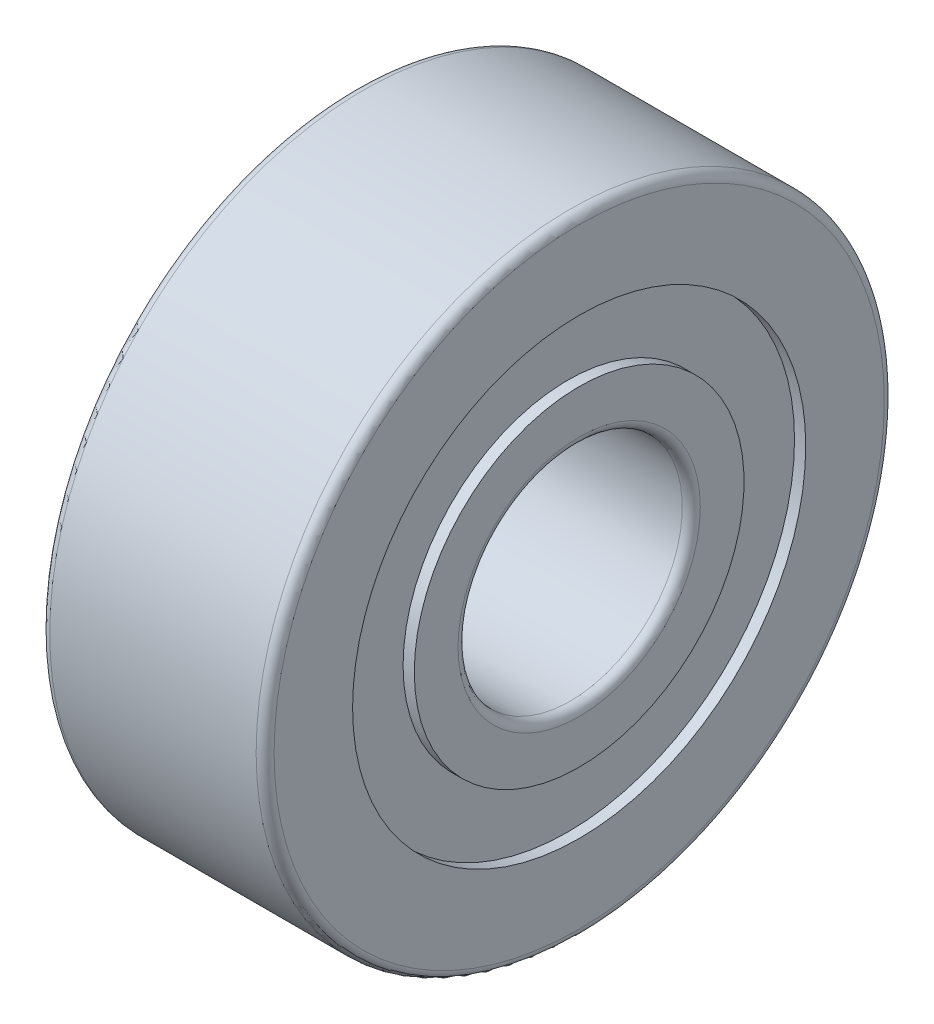
ISO-10303-21;
HEADER;
FILE_DESCRIPTION(('STEP AP214'),'2;1');
FILE_NAME('part.step','',(''),(''),'','','');
FILE_SCHEMA(('AUTOMOTIVE_DESIGN { 1 0 10303 214 1 1 1 1 }'));
ENDSEC;
DATA;
#1=APPLICATION_CONTEXT('core data for automotive mechanical design processes');
#2=APPLICATION_PROTOCOL_DEFINITION('international standard','automotive_design',2000,#1);
#3=PRODUCT_CONTEXT('',#1,'mechanical');
#4=PRODUCT('Part','Part','',(#3));
#5=PRODUCT_RELATED_PRODUCT_CATEGORY('part','',(#4));
#6=PRODUCT_DEFINITION_FORMATION('','',#4);
#7=PRODUCT_DEFINITION_CONTEXT('part definition',#1,'design');
#8=PRODUCT_DEFINITION('design','',#6,#7);
#9=PRODUCT_DEFINITION_SHAPE('','',#8);
#10=(LENGTH_UNIT() NAMED_UNIT(*) SI_UNIT(.MILLI.,.METRE.));
#11=(NAMED_UNIT(*) PLANE_ANGLE_UNIT() SI_UNIT($,.RADIAN.));
#12=(NAMED_UNIT(*) SI_UNIT($,.STERADIAN.) SOLID_ANGLE_UNIT());
#13=UNCERTAINTY_MEASURE_WITH_UNIT(LENGTH_MEASURE(1.E-05),#10,'distance_accuracy_value','');
#14=(GEOMETRIC_REPRESENTATION_CONTEXT(3) GLOBAL_UNCERTAINTY_ASSIGNED_CONTEXT((#13)) GLOBAL_UNIT_ASSIGNED_CONTEXT((#10,
#11,#12)) REPRESENTATION_CONTEXT('',''));
#15=CARTESIAN_POINT('',(0.,0.,0.));
#16=DIRECTION('',(0.,0.,1.));
#17=DIRECTION('',(1.,0.,0.));
#18=AXIS2_PLACEMENT_3D('',#15,#16,#17);
#19=CARTESIAN_POINT('',(-2.5,7.,0.));
#20=DIRECTION('',(1.,0.,0.));
#21=DIRECTION('',(0.,0.,-1.));
#22=AXIS2_PLACEMENT_3D('',#19,#20,#21);
#23=PLANE('',#22);
#24=CARTESIAN_POINT('',(-2.5,0.,0.));
#25=DIRECTION('',(1.,0.,0.));
#26=DIRECTION('',(0.,0.,-1.));
#27=AXIS2_PLACEMENT_3D('',#24,#25,#26);
#28=CIRCLE('',#27,6.8);
#29=CARTESIAN_POINT('',(-2.5,0.,-6.8));
#30=VERTEX_POINT('',#29);
#31=EDGE_CURVE('E45',#30,#30,#28,.F.);
#32=ORIENTED_EDGE('',*,*,#31,.T.);
#33=EDGE_LOOP('',(#32));
#34=FACE_BOUND('',#33,.T.);
#35=CARTESIAN_POINT('',(-2.5,0.,0.));
#36=DIRECTION('',(-1.,0.,0.));
#37=DIRECTION('',(0.,0.,1.));
#38=AXIS2_PLACEMENT_3D('',#35,#36,#37);
#39=CIRCLE('',#38,5.05);
#40=CARTESIAN_POINT('',(-2.5,0.,5.05));
#41=VERTEX_POINT('',#40);
#42=EDGE_CURVE('E62',#41,#41,#39,.T.);
#43=ORIENTED_EDGE('',*,*,#42,.F.);
#44=EDGE_LOOP('',(#43));
#45=FACE_BOUND('',#44,.T.);
#46=ADVANCED_FACE('F30',(#34,#45),#23,.F.);
#47=CARTESIAN_POINT('',(0.,0.,0.));
#48=DIRECTION('',(-1.,0.,0.));
#49=DIRECTION('',(0.,0.,1.));
#50=AXIS2_PLACEMENT_3D('',#47,#48,#49);
#51=CYLINDRICAL_SURFACE('',#50,5.05);
#52=CARTESIAN_POINT('',(-2.25,0.,0.));
#53=DIRECTION('',(-1.,0.,0.));
#54=DIRECTION('',(0.,0.,1.));
#55=AXIS2_PLACEMENT_3D('',#52,#53,#54);
#56=CIRCLE('',#55,5.05);
#57=CARTESIAN_POINT('',(-2.25,0.,5.05));
#58=VERTEX_POINT('',#57);
#59=EDGE_CURVE('E65',#58,#58,#56,.T.);
#60=ORIENTED_EDGE('',*,*,#59,.F.);
#61=EDGE_LOOP('',(#60));
#62=FACE_BOUND('',#61,.T.);
#63=ORIENTED_EDGE('',*,*,#42,.T.);
#64=EDGE_LOOP('',(#63));
#65=FACE_BOUND('',#64,.T.);
#66=ADVANCED_FACE('F119',(#62,#65),#51,.F.);
#67=CARTESIAN_POINT('',(-2.25,5.05,0.));
#68=DIRECTION('',(1.,0.,0.));
#69=DIRECTION('',(0.,0.,-1.));
#70=AXIS2_PLACEMENT_3D('',#67,#68,#69);
#71=PLANE('',#70);
#72=CARTESIAN_POINT('',(-2.25,0.,0.));
#73=DIRECTION('',(-1.,0.,0.));
#74=DIRECTION('',(0.,0.,1.));
#75=AXIS2_PLACEMENT_3D('',#72,#73,#74);
#76=CIRCLE('',#75,3.675);
#77=CARTESIAN_POINT('',(-2.25,0.,3.675));
#78=VERTEX_POINT('',#77);
#79=EDGE_CURVE('E68',#78,#78,#76,.T.);
#80=ORIENTED_EDGE('',*,*,#79,.F.);
#81=EDGE_LOOP('',(#80));
#82=FACE_BOUND('',#81,.T.);
#83=ORIENTED_EDGE('',*,*,#59,.T.);
#84=EDGE_LOOP('',(#83));
#85=FACE_BOUND('',#84,.T.);
#86=ADVANCED_FACE('F125',(#82,#85),#71,.F.);
#87=CARTESIAN_POINT('',(0.,0.,0.));
#88=DIRECTION('',(-1.,0.,0.));
#89=DIRECTION('',(0.,0.,1.));
#90=AXIS2_PLACEMENT_3D('',#87,#88,#89);
#91=CYLINDRICAL_SURFACE('',#90,3.675);
#92=CARTESIAN_POINT('',(-2.5,0.,0.));
#93=DIRECTION('',(-1.,0.,0.));
#94=DIRECTION('',(0.,0.,1.));
#95=AXIS2_PLACEMENT_3D('',#92,#93,#94);
#96=CIRCLE('',#95,3.675);
#97=CARTESIAN_POINT('',(-2.5,0.,3.675));
#98=VERTEX_POINT('',#97);
#99=EDGE_CURVE('E71',#98,#98,#96,.T.);
#100=ORIENTED_EDGE('',*,*,#99,.F.);
#101=EDGE_LOOP('',(#100));
#102=FACE_BOUND('',#101,.T.);
#103=ORIENTED_EDGE('',*,*,#79,.T.);
#104=EDGE_LOOP('',(#103));
#105=FACE_BOUND('',#104,.T.);
#106=ADVANCED_FACE('F179',(#102,#105),#91,.T.);
#107=CARTESIAN_POINT('',(-2.5,3.675,0.));
#108=DIRECTION('',(1.,0.,0.));
#109=DIRECTION('',(0.,0.,-1.));
#110=AXIS2_PLACEMENT_3D('',#107,#108,#109);
#111=PLANE('',#110);
#112=CARTESIAN_POINT('',(-2.5,0.,0.));
#113=DIRECTION('',(1.,0.,0.));
#114=DIRECTION('',(0.,0.,-1.));
#115=AXIS2_PLACEMENT_3D('',#112,#113,#114);
#116=CIRCLE('',#115,2.7);
#117=CARTESIAN_POINT('',(-2.5,0.,-2.7));
#118=VERTEX_POINT('',#117);
#119=EDGE_CURVE('E53',#118,#118,#116,.T.);
#120=ORIENTED_EDGE('',*,*,#119,.T.);
#121=EDGE_LOOP('',(#120));
#122=FACE_BOUND('',#121,.T.);
#123=ORIENTED_EDGE('',*,*,#99,.T.);
#124=EDGE_LOOP('',(#123));
#125=FACE_BOUND('',#124,.T.);
#126=ADVANCED_FACE('F115',(#122,#125),#111,.F.);
#127=CARTESIAN_POINT('',(0.,0.,0.));
#128=DIRECTION('',(-1.,0.,0.));
#129=DIRECTION('',(0.,0.,1.));
#130=AXIS2_PLACEMENT_3D('',#127,#128,#129);
#131=CYLINDRICAL_SURFACE('',#130,2.5);
#132=CARTESIAN_POINT('',(-2.3,0.,0.));
#133=DIRECTION('',(1.,0.,0.));
#134=DIRECTION('',(0.,0.,-1.));
#135=AXIS2_PLACEMENT_3D('',#132,#133,#134);
#136=CIRCLE('',#135,2.5);
#137=CARTESIAN_POINT('',(-2.3,0.,-2.5));
#138=VERTEX_POINT('',#137);
#139=EDGE_CURVE('E56',#138,#138,#136,.F.);
#140=ORIENTED_EDGE('',*,*,#139,.T.);
#141=EDGE_LOOP('',(#140));
#142=FACE_BOUND('',#141,.T.);
#143=CARTESIAN_POINT('',(2.3,0.,0.));
#144=DIRECTION('',(-1.,0.,0.));
#145=DIRECTION('',(0.,0.,1.));
#146=AXIS2_PLACEMENT_3D('',#143,#144,#145);
#147=CIRCLE('',#146,2.5);
#148=CARTESIAN_POINT('',(2.3,0.,2.5));
#149=VERTEX_POINT('',#148);
#150=EDGE_CURVE('E59',#149,#149,#147,.F.);
#151=ORIENTED_EDGE('',*,*,#150,.T.);
#152=EDGE_LOOP('',(#151));
#153=FACE_BOUND('',#152,.T.);
#154=ADVANCED_FACE('F109',(#142,#153),#131,.F.);
#155=CARTESIAN_POINT('',(2.5,3.675,0.));
#156=DIRECTION('',(-1.,0.,0.));
#157=DIRECTION('',(0.,0.,1.));
#158=AXIS2_PLACEMENT_3D('',#155,#156,#157);
#159=PLANE('',#158);
#160=CARTESIAN_POINT('',(2.5,0.,0.));
#161=DIRECTION('',(-1.,0.,0.));
#162=DIRECTION('',(0.,0.,1.));
#163=AXIS2_PLACEMENT_3D('',#160,#161,#162);
#164=CIRCLE('',#163,2.7);
#165=CARTESIAN_POINT('',(2.5,0.,2.7));
#166=VERTEX_POINT('',#165);
#167=EDGE_CURVE('E50',#166,#166,#164,.T.);
#168=ORIENTED_EDGE('',*,*,#167,.T.);
#169=EDGE_LOOP('',(#168));
#170=FACE_BOUND('',#169,.T.);
#171=CARTESIAN_POINT('',(2.5,0.,0.));
#172=DIRECTION('',(-1.,0.,0.));
#173=DIRECTION('',(0.,0.,1.));
#174=AXIS2_PLACEMENT_3D('',#171,#172,#173);
#175=CIRCLE('',#174,3.675);
#176=CARTESIAN_POINT('',(2.5,0.,3.675));
#177=VERTEX_POINT('',#176);
#178=EDGE_CURVE('E74',#177,#177,#175,.T.);
#179=ORIENTED_EDGE('',*,*,#178,.F.);
#180=EDGE_LOOP('',(#179));
#181=FACE_BOUND('',#180,.T.);
#182=ADVANCED_FACE('F104',(#170,#181),#159,.F.);
#183=CARTESIAN_POINT('',(0.,0.,0.));
#184=DIRECTION('',(-1.,0.,0.));
#185=DIRECTION('',(0.,0.,1.));
#186=AXIS2_PLACEMENT_3D('',#183,#184,#185);
#187=CYLINDRICAL_SURFACE('',#186,3.675);
#188=CARTESIAN_POINT('',(2.25,0.,0.));
#189=DIRECTION('',(-1.,0.,0.));
#190=DIRECTION('',(0.,0.,1.));
#191=AXIS2_PLACEMENT_3D('',#188,#189,#190);
#192=CIRCLE('',#191,3.675);
#193=CARTESIAN_POINT('',(2.25,0.,3.675));
#194=VERTEX_POINT('',#193);
#195=EDGE_CURVE('E77',#194,#194,#192,.T.);
#196=ORIENTED_EDGE('',*,*,#195,.F.);
#197=EDGE_LOOP('',(#196));
#198=FACE_BOUND('',#197,.T.);
#199=ORIENTED_EDGE('',*,*,#178,.T.);
#200=EDGE_LOOP('',(#199));
#201=FACE_BOUND('',#200,.T.);
#202=ADVANCED_FACE('F98',(#198,#201),#187,.T.);
#203=CARTESIAN_POINT('',(2.25,5.05,0.));
#204=DIRECTION('',(-1.,0.,0.));
#205=DIRECTION('',(0.,0.,1.));
#206=AXIS2_PLACEMENT_3D('',#203,#204,#205);
#207=PLANE('',#206);
#208=CARTESIAN_POINT('',(2.25,0.,0.));
#209=DIRECTION('',(-1.,0.,0.));
#210=DIRECTION('',(0.,0.,1.));
#211=AXIS2_PLACEMENT_3D('',#208,#209,#210);
#212=CIRCLE('',#211,5.05);
#213=CARTESIAN_POINT('',(2.25,0.,5.05));
#214=VERTEX_POINT('',#213);
#215=EDGE_CURVE('E80',#214,#214,#212,.T.);
#216=ORIENTED_EDGE('',*,*,#215,.F.);
#217=EDGE_LOOP('',(#216));
#218=FACE_BOUND('',#217,.T.);
#219=ORIENTED_EDGE('',*,*,#195,.T.);
#220=EDGE_LOOP('',(#219));
#221=FACE_BOUND('',#220,.T.);
#222=ADVANCED_FACE('F92',(#218,#221),#207,.F.);
#223=CARTESIAN_POINT('',(0.,0.,0.));
#224=DIRECTION('',(-1.,0.,0.));
#225=DIRECTION('',(0.,0.,1.));
#226=AXIS2_PLACEMENT_3D('',#223,#224,#225);
#227=CYLINDRICAL_SURFACE('',#226,5.05);
#228=CARTESIAN_POINT('',(2.5,0.,0.));
#229=DIRECTION('',(-1.,0.,0.));
#230=DIRECTION('',(0.,0.,1.));
#231=AXIS2_PLACEMENT_3D('',#228,#229,#230);
#232=CIRCLE('',#231,5.05);
#233=CARTESIAN_POINT('',(2.5,0.,5.05));
#234=VERTEX_POINT('',#233);
#235=EDGE_CURVE('E83',#234,#234,#232,.T.);
#236=ORIENTED_EDGE('',*,*,#235,.F.);
#237=EDGE_LOOP('',(#236));
#238=FACE_BOUND('',#237,.T.);
#239=ORIENTED_EDGE('',*,*,#215,.T.);
#240=EDGE_LOOP('',(#239));
#241=FACE_BOUND('',#240,.T.);
#242=ADVANCED_FACE('F89',(#238,#241),#227,.F.);
#243=CARTESIAN_POINT('',(2.5,7.,0.));
#244=DIRECTION('',(-1.,0.,0.));
#245=DIRECTION('',(0.,0.,1.));
#246=AXIS2_PLACEMENT_3D('',#243,#244,#245);
#247=PLANE('',#246);
#248=CARTESIAN_POINT('',(2.5,0.,0.));
#249=DIRECTION('',(-1.,0.,0.));
#250=DIRECTION('',(0.,0.,1.));
#251=AXIS2_PLACEMENT_3D('',#248,#249,#250);
#252=CIRCLE('',#251,6.8);
#253=CARTESIAN_POINT('',(2.5,0.,6.8));
#254=VERTEX_POINT('',#253);
#255=EDGE_CURVE('E10',#254,#254,#252,.F.);
#256=ORIENTED_EDGE('',*,*,#255,.T.);
#257=EDGE_LOOP('',(#256));
#258=FACE_BOUND('',#257,.T.);
#259=ORIENTED_EDGE('',*,*,#235,.T.);
#260=EDGE_LOOP('',(#259));
#261=FACE_BOUND('',#260,.T.);
#262=ADVANCED_FACE('F87',(#258,#261),#247,.F.);
#263=CARTESIAN_POINT('',(0.,0.,0.));
#264=DIRECTION('',(-1.,0.,0.));
#265=DIRECTION('',(0.,0.,1.));
#266=AXIS2_PLACEMENT_3D('',#263,#264,#265);
#267=CYLINDRICAL_SURFACE('',#266,7.);
#268=CARTESIAN_POINT('',(-2.3,0.,0.));
#269=DIRECTION('',(1.,0.,0.));
#270=DIRECTION('',(0.,0.,-1.));
#271=AXIS2_PLACEMENT_3D('',#268,#269,#270);
#272=CIRCLE('',#271,7.);
#273=CARTESIAN_POINT('',(-2.3,0.,-7.));
#274=VERTEX_POINT('',#273);
#275=EDGE_CURVE('E37',#274,#274,#272,.T.);
#276=ORIENTED_EDGE('',*,*,#275,.T.);
#277=EDGE_LOOP('',(#276));
#278=FACE_BOUND('',#277,.T.);
#279=CARTESIAN_POINT('',(2.3,0.,0.));
#280=DIRECTION('',(-1.,0.,0.));
#281=DIRECTION('',(0.,0.,1.));
#282=AXIS2_PLACEMENT_3D('',#279,#280,#281);
#283=CIRCLE('',#282,7.);
#284=CARTESIAN_POINT('',(2.3,0.,7.));
#285=VERTEX_POINT('',#284);
#286=EDGE_CURVE('E41',#285,#285,#283,.T.);
#287=ORIENTED_EDGE('',*,*,#286,.T.);
#288=EDGE_LOOP('',(#287));
#289=FACE_BOUND('',#288,.T.);
#290=ADVANCED_FACE('F135',(#278,#289),#267,.T.);
#291=CARTESIAN_POINT('',(-2.3,0.,0.));
#292=DIRECTION('',(1.,0.,0.));
#293=DIRECTION('',(0.,0.,-1.));
#294=AXIS2_PLACEMENT_3D('',#291,#292,#293);
#295=TOROIDAL_SURFACE('',#294,2.7,0.2);
#296=ORIENTED_EDGE('',*,*,#119,.F.);
#297=EDGE_LOOP('',(#296));
#298=FACE_BOUND('',#297,.T.);
#299=ORIENTED_EDGE('',*,*,#139,.F.);
#300=EDGE_LOOP('',(#299));
#301=FACE_BOUND('',#300,.T.);
#302=ADVANCED_FACE('F131',(#298,#301),#295,.T.);
#303=CARTESIAN_POINT('',(2.3,0.,0.));
#304=DIRECTION('',(-1.,0.,0.));
#305=DIRECTION('',(0.,0.,1.));
#306=AXIS2_PLACEMENT_3D('',#303,#304,#305);
#307=TOROIDAL_SURFACE('',#306,2.7,0.2);
#308=ORIENTED_EDGE('',*,*,#150,.F.);
#309=EDGE_LOOP('',(#308));
#310=FACE_BOUND('',#309,.T.);
#311=ORIENTED_EDGE('',*,*,#167,.F.);
#312=EDGE_LOOP('',(#311));
#313=FACE_BOUND('',#312,.T.);
#314=ADVANCED_FACE('F134',(#310,#313),#307,.T.);
#315=CARTESIAN_POINT('',(-2.3,0.,0.));
#316=DIRECTION('',(1.,0.,0.));
#317=DIRECTION('',(0.,0.,-1.));
#318=AXIS2_PLACEMENT_3D('',#315,#316,#317);
#319=TOROIDAL_SURFACE('',#318,6.8,0.2);
#320=ORIENTED_EDGE('',*,*,#275,.F.);
#321=EDGE_LOOP('',(#320));
#322=FACE_BOUND('',#321,.T.);
#323=ORIENTED_EDGE('',*,*,#31,.F.);
#324=EDGE_LOOP('',(#323));
#325=FACE_BOUND('',#324,.T.);
#326=ADVANCED_FACE('F138',(#322,#325),#319,.T.);
#327=CARTESIAN_POINT('',(2.3,0.,0.));
#328=DIRECTION('',(-1.,0.,0.));
#329=DIRECTION('',(0.,0.,1.));
#330=AXIS2_PLACEMENT_3D('',#327,#328,#329);
#331=TOROIDAL_SURFACE('',#330,6.8,0.2);
#332=ORIENTED_EDGE('',*,*,#255,.F.);
#333=EDGE_LOOP('',(#332));
#334=FACE_BOUND('',#333,.T.);
#335=ORIENTED_EDGE('',*,*,#286,.F.);
#336=EDGE_LOOP('',(#335));
#337=FACE_BOUND('',#336,.T.);
#338=ADVANCED_FACE('F32',(#334,#337),#331,.T.);
#339=CLOSED_SHELL('',(#46,#66,#86,#106,#126,#154,#182,#202,#222,#242,#262,#290,#302,#314,#326,#338));
#340=MANIFOLD_SOLID_BREP('B2',#339);
#341=ADVANCED_BREP_SHAPE_REPRESENTATION('',(#18,#340),#14);
#342=SHAPE_DEFINITION_REPRESENTATION(#9,#341);
ENDSEC;
END-ISO-10303-21;
